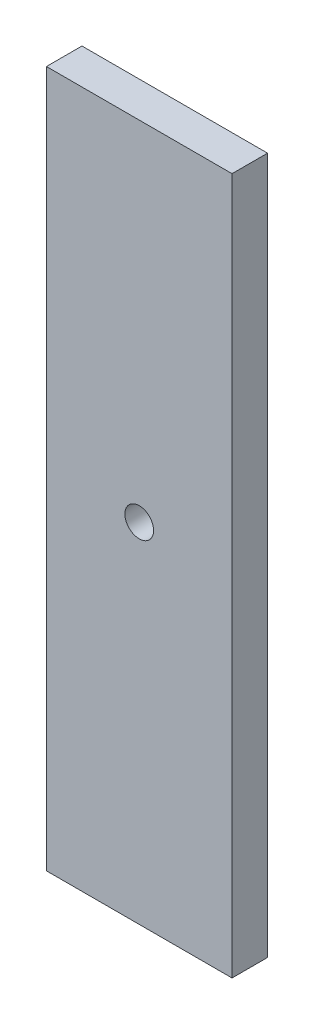
ISO-10303-21;
HEADER;
FILE_DESCRIPTION(('STEP AP214'),'2;1');
FILE_NAME('part.step','',(''),(''),'','','');
FILE_SCHEMA(('AUTOMOTIVE_DESIGN { 1 0 10303 214 1 1 1 1 }'));
ENDSEC;
DATA;
#1=APPLICATION_CONTEXT('core data for automotive mechanical design processes');
#2=APPLICATION_PROTOCOL_DEFINITION('international standard','automotive_design',2000,#1);
#3=PRODUCT_CONTEXT('',#1,'mechanical');
#4=PRODUCT('Part','Part','',(#3));
#5=PRODUCT_RELATED_PRODUCT_CATEGORY('part','',(#4));
#6=PRODUCT_DEFINITION_FORMATION('','',#4);
#7=PRODUCT_DEFINITION_CONTEXT('part definition',#1,'design');
#8=PRODUCT_DEFINITION('design','',#6,#7);
#9=PRODUCT_DEFINITION_SHAPE('','',#8);
#10=(LENGTH_UNIT() NAMED_UNIT(*) SI_UNIT(.MILLI.,.METRE.));
#11=(NAMED_UNIT(*) PLANE_ANGLE_UNIT() SI_UNIT($,.RADIAN.));
#12=(NAMED_UNIT(*) SI_UNIT($,.STERADIAN.) SOLID_ANGLE_UNIT());
#13=UNCERTAINTY_MEASURE_WITH_UNIT(LENGTH_MEASURE(1.E-05),#10,'distance_accuracy_value','');
#14=(GEOMETRIC_REPRESENTATION_CONTEXT(3) GLOBAL_UNCERTAINTY_ASSIGNED_CONTEXT((#13)) GLOBAL_UNIT_ASSIGNED_CONTEXT((#10,
#11,#12)) REPRESENTATION_CONTEXT('',''));
#15=CARTESIAN_POINT('',(0.,0.,0.));
#16=DIRECTION('',(0.,0.,1.));
#17=DIRECTION('',(1.,0.,0.));
#18=AXIS2_PLACEMENT_3D('',#15,#16,#17);
#19=CARTESIAN_POINT('',(0.,0.,2.794));
#20=DIRECTION('',(0.,0.,-1.));
#21=DIRECTION('',(-1.,0.,0.));
#22=AXIS2_PLACEMENT_3D('',#19,#20,#21);
#23=PLANE('',#22);
#24=DIRECTION('',(0.,-1.,0.));
#25=VECTOR('',#24,1.);
#26=CARTESIAN_POINT('',(-47.3,1.35000000000002,2.794));
#27=LINE('',#26,#25);
#28=CARTESIAN_POINT('',(-47.3,56.15,2.794));
#29=VERTEX_POINT('',#28);
#30=CARTESIAN_POINT('',(-47.3,1.35000000000002,2.794));
#31=VERTEX_POINT('',#30);
#32=EDGE_CURVE('E85',#29,#31,#27,.T.);
#33=ORIENTED_EDGE('',*,*,#32,.T.);
#34=DIRECTION('',(1.,0.,0.));
#35=VECTOR('',#34,1.);
#36=CARTESIAN_POINT('',(-47.3,1.35000000000002,2.794));
#37=LINE('',#36,#35);
#38=CARTESIAN_POINT('',(-32.7,1.35000000000002,2.794));
#39=VERTEX_POINT('',#38);
#40=EDGE_CURVE('E80',#31,#39,#37,.T.);
#41=ORIENTED_EDGE('',*,*,#40,.T.);
#42=DIRECTION('',(0.,1.,0.));
#43=VECTOR('',#42,1.);
#44=CARTESIAN_POINT('',(-32.7,1.35000000000002,2.794));
#45=LINE('',#44,#43);
#46=CARTESIAN_POINT('',(-32.7,56.15,2.794));
#47=VERTEX_POINT('',#46);
#48=EDGE_CURVE('E83',#39,#47,#45,.T.);
#49=ORIENTED_EDGE('',*,*,#48,.T.);
#50=DIRECTION('',(-1.,0.,0.));
#51=VECTOR('',#50,1.);
#52=CARTESIAN_POINT('',(-47.3,56.15,2.794));
#53=LINE('',#52,#51);
#54=EDGE_CURVE('E50',#47,#29,#53,.T.);
#55=ORIENTED_EDGE('',*,*,#54,.T.);
#56=EDGE_LOOP('',(#33,#41,#49,#55));
#57=FACE_BOUND('',#56,.T.);
#58=CARTESIAN_POINT('',(-40.,28.75,2.794));
#59=DIRECTION('',(0.,0.,1.));
#60=DIRECTION('',(1.,0.,0.));
#61=AXIS2_PLACEMENT_3D('',#58,#59,#60);
#62=CIRCLE('',#61,1.12937475365627);
#63=CARTESIAN_POINT('',(-38.8706252463437,28.75,2.794));
#64=VERTEX_POINT('',#63);
#65=EDGE_CURVE('E100',#64,#64,#62,.T.);
#66=ORIENTED_EDGE('',*,*,#65,.F.);
#67=EDGE_LOOP('',(#66));
#68=FACE_BOUND('',#67,.T.);
#69=ADVANCED_FACE('F33',(#57,#68),#23,.F.);
#70=CARTESIAN_POINT('',(0.,0.,0.));
#71=DIRECTION('',(0.,0.,-1.));
#72=DIRECTION('',(-1.,0.,0.));
#73=AXIS2_PLACEMENT_3D('',#70,#71,#72);
#74=PLANE('',#73);
#75=DIRECTION('',(0.,-1.,0.));
#76=VECTOR('',#75,1.);
#77=CARTESIAN_POINT('',(-47.3,1.35000000000002,0.));
#78=LINE('',#77,#76);
#79=CARTESIAN_POINT('',(-47.3,56.15,0.));
#80=VERTEX_POINT('',#79);
#81=CARTESIAN_POINT('',(-47.3,1.35000000000002,0.));
#82=VERTEX_POINT('',#81);
#83=EDGE_CURVE('E97',#80,#82,#78,.T.);
#84=ORIENTED_EDGE('',*,*,#83,.F.);
#85=DIRECTION('',(-1.,0.,0.));
#86=VECTOR('',#85,1.);
#87=CARTESIAN_POINT('',(-47.3,56.15,0.));
#88=LINE('',#87,#86);
#89=CARTESIAN_POINT('',(-32.7,56.15,0.));
#90=VERTEX_POINT('',#89);
#91=EDGE_CURVE('E73',#90,#80,#88,.T.);
#92=ORIENTED_EDGE('',*,*,#91,.F.);
#93=DIRECTION('',(0.,1.,0.));
#94=VECTOR('',#93,1.);
#95=CARTESIAN_POINT('',(-32.7,1.35000000000002,0.));
#96=LINE('',#95,#94);
#97=CARTESIAN_POINT('',(-32.7,1.35000000000002,0.));
#98=VERTEX_POINT('',#97);
#99=EDGE_CURVE('E67',#98,#90,#96,.T.);
#100=ORIENTED_EDGE('',*,*,#99,.F.);
#101=DIRECTION('',(1.,0.,0.));
#102=VECTOR('',#101,1.);
#103=CARTESIAN_POINT('',(-47.3,1.35000000000002,0.));
#104=LINE('',#103,#102);
#105=EDGE_CURVE('E89',#82,#98,#104,.T.);
#106=ORIENTED_EDGE('',*,*,#105,.F.);
#107=EDGE_LOOP('',(#84,#92,#100,#106));
#108=FACE_BOUND('',#107,.T.);
#109=CARTESIAN_POINT('',(-40.,28.75,0.));
#110=DIRECTION('',(0.,0.,1.));
#111=DIRECTION('',(1.,0.,0.));
#112=AXIS2_PLACEMENT_3D('',#109,#110,#111);
#113=CIRCLE('',#112,1.12937475365627);
#114=CARTESIAN_POINT('',(-38.8706252463437,28.75,0.));
#115=VERTEX_POINT('',#114);
#116=EDGE_CURVE('E112',#115,#115,#113,.T.);
#117=ORIENTED_EDGE('',*,*,#116,.T.);
#118=EDGE_LOOP('',(#117));
#119=FACE_BOUND('',#118,.T.);
#120=ADVANCED_FACE('F108',(#108,#119),#74,.T.);
#121=CARTESIAN_POINT('',(-47.3,1.35000000000002,2.794));
#122=DIRECTION('',(1.,0.,0.));
#123=DIRECTION('',(0.,0.,-1.));
#124=AXIS2_PLACEMENT_3D('',#121,#122,#123);
#125=PLANE('',#124);
#126=ORIENTED_EDGE('',*,*,#83,.T.);
#127=DIRECTION('',(0.,0.,-1.));
#128=VECTOR('',#127,1.);
#129=CARTESIAN_POINT('',(-47.3,1.35000000000002,2.794));
#130=LINE('',#129,#128);
#131=EDGE_CURVE('E11',#31,#82,#130,.T.);
#132=ORIENTED_EDGE('',*,*,#131,.F.);
#133=ORIENTED_EDGE('',*,*,#32,.F.);
#134=DIRECTION('',(0.,0.,-1.));
#135=VECTOR('',#134,1.);
#136=CARTESIAN_POINT('',(-47.3,56.15,2.794));
#137=LINE('',#136,#135);
#138=EDGE_CURVE('E93',#29,#80,#137,.T.);
#139=ORIENTED_EDGE('',*,*,#138,.T.);
#140=EDGE_LOOP('',(#126,#132,#133,#139));
#141=FACE_BOUND('',#140,.T.);
#142=ADVANCED_FACE('F35',(#141),#125,.F.);
#143=CARTESIAN_POINT('',(-47.3,1.35000000000002,2.794));
#144=DIRECTION('',(0.,1.,0.));
#145=DIRECTION('',(0.,0.,1.));
#146=AXIS2_PLACEMENT_3D('',#143,#144,#145);
#147=PLANE('',#146);
#148=ORIENTED_EDGE('',*,*,#105,.T.);
#149=DIRECTION('',(0.,0.,-1.));
#150=VECTOR('',#149,1.);
#151=CARTESIAN_POINT('',(-32.7,1.35000000000002,2.794));
#152=LINE('',#151,#150);
#153=EDGE_CURVE('E42',#39,#98,#152,.T.);
#154=ORIENTED_EDGE('',*,*,#153,.F.);
#155=ORIENTED_EDGE('',*,*,#40,.F.);
#156=ORIENTED_EDGE('',*,*,#131,.T.);
#157=EDGE_LOOP('',(#148,#154,#155,#156));
#158=FACE_BOUND('',#157,.T.);
#159=ADVANCED_FACE('F88',(#158),#147,.F.);
#160=CARTESIAN_POINT('',(-32.7,1.35000000000002,2.794));
#161=DIRECTION('',(-1.,0.,0.));
#162=DIRECTION('',(0.,0.,1.));
#163=AXIS2_PLACEMENT_3D('',#160,#161,#162);
#164=PLANE('',#163);
#165=ORIENTED_EDGE('',*,*,#99,.T.);
#166=DIRECTION('',(0.,0.,-1.));
#167=VECTOR('',#166,1.);
#168=CARTESIAN_POINT('',(-32.7,56.15,2.794));
#169=LINE('',#168,#167);
#170=EDGE_CURVE('E90',#47,#90,#169,.T.);
#171=ORIENTED_EDGE('',*,*,#170,.F.);
#172=ORIENTED_EDGE('',*,*,#48,.F.);
#173=ORIENTED_EDGE('',*,*,#153,.T.);
#174=EDGE_LOOP('',(#165,#171,#172,#173));
#175=FACE_BOUND('',#174,.T.);
#176=ADVANCED_FACE('F91',(#175),#164,.F.);
#177=CARTESIAN_POINT('',(-47.3,56.15,2.794));
#178=DIRECTION('',(0.,-1.,0.));
#179=DIRECTION('',(0.,0.,-1.));
#180=AXIS2_PLACEMENT_3D('',#177,#178,#179);
#181=PLANE('',#180);
#182=ORIENTED_EDGE('',*,*,#91,.T.);
#183=ORIENTED_EDGE('',*,*,#138,.F.);
#184=ORIENTED_EDGE('',*,*,#54,.F.);
#185=ORIENTED_EDGE('',*,*,#170,.T.);
#186=EDGE_LOOP('',(#182,#183,#184,#185));
#187=FACE_BOUND('',#186,.T.);
#188=ADVANCED_FACE('F105',(#187),#181,.F.);
#189=CARTESIAN_POINT('',(-40.,28.75,2.794));
#190=DIRECTION('',(0.,0.,-1.));
#191=DIRECTION('',(-1.,0.,0.));
#192=AXIS2_PLACEMENT_3D('',#189,#190,#191);
#193=CYLINDRICAL_SURFACE('',#192,1.12937475365627);
#194=ORIENTED_EDGE('',*,*,#65,.T.);
#195=EDGE_LOOP('',(#194));
#196=FACE_BOUND('',#195,.T.);
#197=ORIENTED_EDGE('',*,*,#116,.F.);
#198=EDGE_LOOP('',(#197));
#199=FACE_BOUND('',#198,.T.);
#200=ADVANCED_FACE('F118',(#196,#199),#193,.F.);
#201=CLOSED_SHELL('',(#69,#120,#142,#159,#176,#188,#200));
#202=MANIFOLD_SOLID_BREP('B2',#201);
#203=ADVANCED_BREP_SHAPE_REPRESENTATION('',(#18,#202),#14);
#204=SHAPE_DEFINITION_REPRESENTATION(#9,#203);
ENDSEC;
END-ISO-10303-21;
